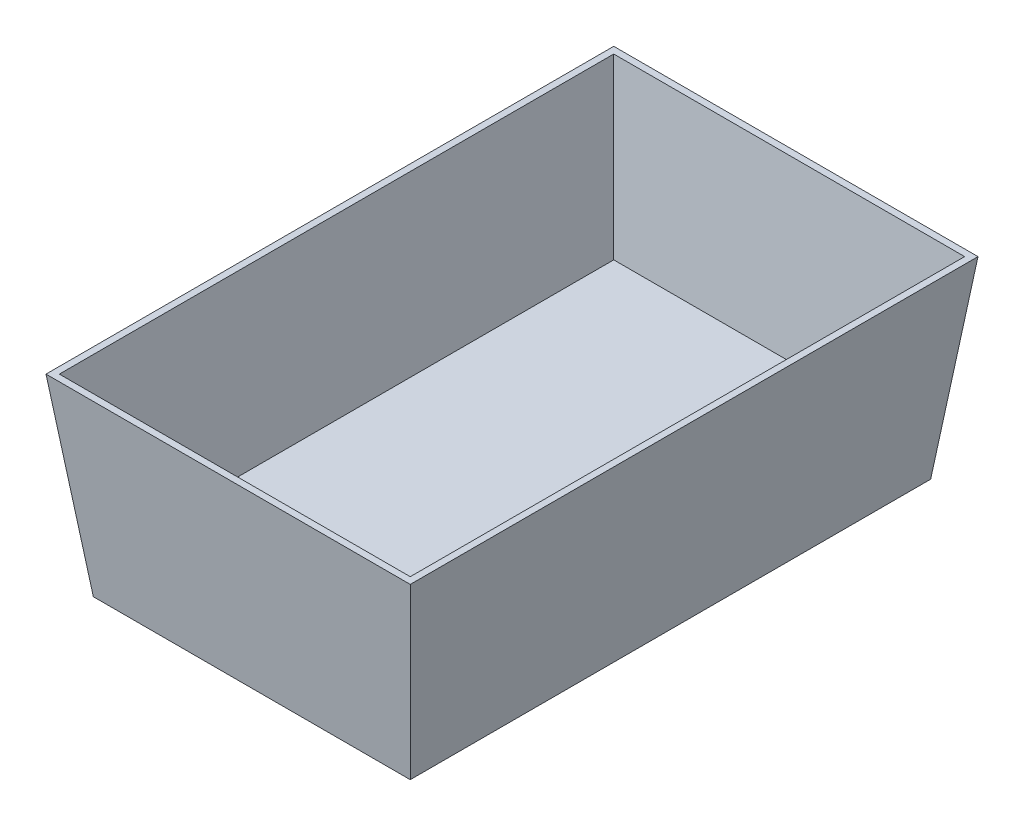
ISO-10303-21;
HEADER;
FILE_DESCRIPTION(('STEP AP214'),'2;1');
FILE_NAME('part.step','',(''),(''),'','','');
FILE_SCHEMA(('AUTOMOTIVE_DESIGN { 1 0 10303 214 1 1 1 1 }'));
ENDSEC;
DATA;
#1=APPLICATION_CONTEXT('core data for automotive mechanical design processes');
#2=APPLICATION_PROTOCOL_DEFINITION('international standard','automotive_design',2000,#1);
#3=PRODUCT_CONTEXT('',#1,'mechanical');
#4=PRODUCT('Part','Part','',(#3));
#5=PRODUCT_RELATED_PRODUCT_CATEGORY('part','',(#4));
#6=PRODUCT_DEFINITION_FORMATION('','',#4);
#7=PRODUCT_DEFINITION_CONTEXT('part definition',#1,'design');
#8=PRODUCT_DEFINITION('design','',#6,#7);
#9=PRODUCT_DEFINITION_SHAPE('','',#8);
#10=(LENGTH_UNIT() NAMED_UNIT(*) SI_UNIT(.MILLI.,.METRE.));
#11=(NAMED_UNIT(*) PLANE_ANGLE_UNIT() SI_UNIT($,.RADIAN.));
#12=(NAMED_UNIT(*) SI_UNIT($,.STERADIAN.) SOLID_ANGLE_UNIT());
#13=UNCERTAINTY_MEASURE_WITH_UNIT(LENGTH_MEASURE(1.E-05),#10,'distance_accuracy_value','');
#14=(GEOMETRIC_REPRESENTATION_CONTEXT(3) GLOBAL_UNCERTAINTY_ASSIGNED_CONTEXT((#13)) GLOBAL_UNIT_ASSIGNED_CONTEXT((#10,
#11,#12)) REPRESENTATION_CONTEXT('',''));
#15=CARTESIAN_POINT('',(0.,0.,0.));
#16=DIRECTION('',(0.,0.,1.));
#17=DIRECTION('',(1.,0.,0.));
#18=AXIS2_PLACEMENT_3D('',#15,#16,#17);
#19=CARTESIAN_POINT('',(-227.895753161623,0.,-294.347660511142));
#20=DIRECTION('',(0.992546151641322,-0.121869343405148,0.));
#21=DIRECTION('',(0.121869343405148,0.992546151641322,0.));
#22=AXIS2_PLACEMENT_3D('',#19,#20,#21);
#23=PLANE('',#22);
#24=DIRECTION('',(0.,0.,-1.));
#25=VECTOR('',#24,1.);
#26=CARTESIAN_POINT('',(-227.895753161623,0.,-294.347660511142));
#27=LINE('',#26,#25);
#28=CARTESIAN_POINT('',(-227.895753161623,0.,485.652339488858));
#29=VERTEX_POINT('',#28);
#30=CARTESIAN_POINT('',(-227.895753161623,0.,-294.347660511142));
#31=VERTEX_POINT('',#30);
#32=EDGE_CURVE('E141',#29,#31,#27,.T.);
#33=ORIENTED_EDGE('',*,*,#32,.T.);
#34=DIRECTION('',(-0.120974291151355,-0.985256536015293,0.120974291151355));
#35=VECTOR('',#34,1.);
#36=CARTESIAN_POINT('',(-227.895753161623,0.,-294.347660511142));
#37=LINE('',#36,#35);
#38=CARTESIAN_POINT('',(-192.411015060684,289.,-329.832398612081));
#39=VERTEX_POINT('',#38);
#40=EDGE_CURVE('E11',#39,#31,#37,.T.);
#41=ORIENTED_EDGE('',*,*,#40,.F.);
#42=DIRECTION('',(0.,0.,1.));
#43=VECTOR('',#42,1.);
#44=CARTESIAN_POINT('',(-192.411015060684,289.,0.));
#45=LINE('',#44,#43);
#46=CARTESIAN_POINT('',(-192.411015060683,289.,521.137077589798));
#47=VERTEX_POINT('',#46);
#48=EDGE_CURVE('E169',#47,#39,#45,.F.);
#49=ORIENTED_EDGE('',*,*,#48,.F.);
#50=DIRECTION('',(-0.120974291151355,-0.985256536015293,-0.120974291151355));
#51=VECTOR('',#50,1.);
#52=CARTESIAN_POINT('',(-239.31088087489,-92.9687546164175,474.237211775591));
#53=LINE('',#52,#51);
#54=EDGE_CURVE('E171',#47,#29,#53,.T.);
#55=ORIENTED_EDGE('',*,*,#54,.T.);
#56=EDGE_LOOP('',(#33,#41,#49,#55));
#57=FACE_BOUND('',#56,.T.);
#58=ADVANCED_FACE('F39',(#57),#23,.T.);
#59=CARTESIAN_POINT('',(-227.895753161623,0.,-294.347660511142));
#60=DIRECTION('',(0.,-0.121869343405148,-0.992546151641322));
#61=DIRECTION('',(0.,0.992546151641322,-0.121869343405148));
#62=AXIS2_PLACEMENT_3D('',#59,#60,#61);
#63=PLANE('',#62);
#64=DIRECTION('',(-1.,0.,0.));
#65=VECTOR('',#64,1.);
#66=CARTESIAN_POINT('',(-227.895753161623,0.,-294.347660511142));
#67=LINE('',#66,#65);
#68=CARTESIAN_POINT('',(-702.895753161623,0.,-294.347660511142));
#69=VERTEX_POINT('',#68);
#70=EDGE_CURVE('E161',#31,#69,#67,.T.);
#71=ORIENTED_EDGE('',*,*,#70,.T.);
#72=DIRECTION('',(0.120974291151355,-0.985256536015293,0.120974291151355));
#73=VECTOR('',#72,1.);
#74=CARTESIAN_POINT('',(-702.895753161623,0.,-294.347660511142));
#75=LINE('',#74,#73);
#76=CARTESIAN_POINT('',(-738.380491262562,289.,-329.832398612081));
#77=VERTEX_POINT('',#76);
#78=EDGE_CURVE('E49',#77,#69,#75,.T.);
#79=ORIENTED_EDGE('',*,*,#78,.F.);
#80=DIRECTION('',(1.,0.,0.));
#81=VECTOR('',#80,1.);
#82=CARTESIAN_POINT('',(0.,289.,-329.832398612081));
#83=LINE('',#82,#81);
#84=EDGE_CURVE('E184',#39,#77,#83,.F.);
#85=ORIENTED_EDGE('',*,*,#84,.F.);
#86=ORIENTED_EDGE('',*,*,#40,.T.);
#87=EDGE_LOOP('',(#71,#79,#85,#86));
#88=FACE_BOUND('',#87,.T.);
#89=ADVANCED_FACE('F41',(#88),#63,.T.);
#90=CARTESIAN_POINT('',(-702.895753161623,0.,-294.347660511142));
#91=DIRECTION('',(-0.992546151641322,-0.121869343405148,0.));
#92=DIRECTION('',(0.121869343405148,-0.992546151641322,0.));
#93=AXIS2_PLACEMENT_3D('',#90,#91,#92);
#94=PLANE('',#93);
#95=DIRECTION('',(0.,0.,1.));
#96=VECTOR('',#95,1.);
#97=CARTESIAN_POINT('',(-702.895753161623,0.,-294.347660511142));
#98=LINE('',#97,#96);
#99=CARTESIAN_POINT('',(-702.895753161623,0.,485.652339488858));
#100=VERTEX_POINT('',#99);
#101=EDGE_CURVE('E164',#69,#100,#98,.T.);
#102=ORIENTED_EDGE('',*,*,#101,.T.);
#103=DIRECTION('',(0.120974291151355,-0.985256536015293,-0.120974291151355));
#104=VECTOR('',#103,1.);
#105=CARTESIAN_POINT('',(-695.944233079826,-56.6155877471774,478.700819407061));
#106=LINE('',#105,#104);
#107=CARTESIAN_POINT('',(-738.380491262562,289.,521.137077589798));
#108=VERTEX_POINT('',#107);
#109=EDGE_CURVE('E175',#108,#100,#106,.T.);
#110=ORIENTED_EDGE('',*,*,#109,.F.);
#111=DIRECTION('',(0.,0.,-1.));
#112=VECTOR('',#111,1.);
#113=CARTESIAN_POINT('',(-738.380491262562,289.,0.));
#114=LINE('',#113,#112);
#115=EDGE_CURVE('E186',#77,#108,#114,.F.);
#116=ORIENTED_EDGE('',*,*,#115,.F.);
#117=ORIENTED_EDGE('',*,*,#78,.T.);
#118=EDGE_LOOP('',(#102,#110,#116,#117));
#119=FACE_BOUND('',#118,.T.);
#120=ADVANCED_FACE('F193',(#119),#94,.T.);
#121=CARTESIAN_POINT('',(-227.895753161623,0.,485.652339488858));
#122=DIRECTION('',(0.,-0.121869343405148,0.992546151641322));
#123=DIRECTION('',(0.,-0.992546151641322,-0.121869343405148));
#124=AXIS2_PLACEMENT_3D('',#121,#122,#123);
#125=PLANE('',#124);
#126=DIRECTION('',(1.,0.,0.));
#127=VECTOR('',#126,1.);
#128=CARTESIAN_POINT('',(-227.895753161623,0.,485.652339488858));
#129=LINE('',#128,#127);
#130=EDGE_CURVE('E167',#100,#29,#129,.T.);
#131=ORIENTED_EDGE('',*,*,#130,.T.);
#132=ORIENTED_EDGE('',*,*,#54,.F.);
#133=DIRECTION('',(-1.,0.,0.));
#134=VECTOR('',#133,1.);
#135=CARTESIAN_POINT('',(0.,289.,521.137077589798));
#136=LINE('',#135,#134);
#137=EDGE_CURVE('E43',#108,#47,#136,.F.);
#138=ORIENTED_EDGE('',*,*,#137,.F.);
#139=ORIENTED_EDGE('',*,*,#109,.T.);
#140=EDGE_LOOP('',(#131,#132,#138,#139));
#141=FACE_BOUND('',#140,.T.);
#142=ADVANCED_FACE('F197',(#141),#125,.T.);
#143=CARTESIAN_POINT('',(0.,289.,0.));
#144=DIRECTION('',(0.,-1.,0.));
#145=DIRECTION('',(0.,0.,-1.));
#146=AXIS2_PLACEMENT_3D('',#143,#144,#145);
#147=PLANE('',#146);
#148=DIRECTION('',(1.,0.,0.));
#149=VECTOR('',#148,1.);
#150=CARTESIAN_POINT('',(-728.380491262562,289.,511.137077589798));
#151=LINE('',#150,#149);
#152=CARTESIAN_POINT('',(-728.380491262562,289.,511.137077589798));
#153=VERTEX_POINT('',#152);
#154=CARTESIAN_POINT('',(-202.411015060684,289.,511.137077589798));
#155=VERTEX_POINT('',#154);
#156=EDGE_CURVE('E123',#153,#155,#151,.T.);
#157=ORIENTED_EDGE('',*,*,#156,.F.);
#158=DIRECTION('',(0.,0.,1.));
#159=VECTOR('',#158,1.);
#160=CARTESIAN_POINT('',(-728.380491262562,289.,-319.832398612081));
#161=LINE('',#160,#159);
#162=CARTESIAN_POINT('',(-728.380491262562,289.,-319.832398612081));
#163=VERTEX_POINT('',#162);
#164=EDGE_CURVE('E57',#163,#153,#161,.T.);
#165=ORIENTED_EDGE('',*,*,#164,.F.);
#166=DIRECTION('',(-1.,0.,0.));
#167=VECTOR('',#166,1.);
#168=CARTESIAN_POINT('',(-728.380491262562,289.,-319.832398612081));
#169=LINE('',#168,#167);
#170=CARTESIAN_POINT('',(-202.411015060684,289.,-319.832398612081));
#171=VERTEX_POINT('',#170);
#172=EDGE_CURVE('E130',#171,#163,#169,.T.);
#173=ORIENTED_EDGE('',*,*,#172,.F.);
#174=DIRECTION('',(0.,0.,-1.));
#175=VECTOR('',#174,1.);
#176=CARTESIAN_POINT('',(-202.411015060684,289.,-319.832398612081));
#177=LINE('',#176,#175);
#178=EDGE_CURVE('E111',#155,#171,#177,.T.);
#179=ORIENTED_EDGE('',*,*,#178,.F.);
#180=EDGE_LOOP('',(#157,#165,#173,#179));
#181=FACE_BOUND('',#180,.T.);
#182=ORIENTED_EDGE('',*,*,#48,.T.);
#183=ORIENTED_EDGE('',*,*,#84,.T.);
#184=ORIENTED_EDGE('',*,*,#115,.T.);
#185=ORIENTED_EDGE('',*,*,#137,.T.);
#186=EDGE_LOOP('',(#182,#183,#184,#185));
#187=FACE_BOUND('',#186,.T.);
#188=ADVANCED_FACE('F128',(#181,#187),#147,.F.);
#189=CARTESIAN_POINT('',(0.,0.,0.));
#190=DIRECTION('',(0.,-1.,0.));
#191=DIRECTION('',(0.,0.,-1.));
#192=AXIS2_PLACEMENT_3D('',#189,#190,#191);
#193=PLANE('',#192);
#194=ORIENTED_EDGE('',*,*,#32,.F.);
#195=ORIENTED_EDGE('',*,*,#130,.F.);
#196=ORIENTED_EDGE('',*,*,#101,.F.);
#197=ORIENTED_EDGE('',*,*,#70,.F.);
#198=EDGE_LOOP('',(#194,#195,#196,#197));
#199=FACE_BOUND('',#198,.T.);
#200=ADVANCED_FACE('F204',(#199),#193,.T.);
#201=CARTESIAN_POINT('',(-728.380491262562,289.,-319.832398612081));
#202=DIRECTION('',(-0.992546151641322,-0.121869343405148,0.));
#203=DIRECTION('',(0.121869343405148,-0.992546151641322,0.));
#204=AXIS2_PLACEMENT_3D('',#201,#202,#203);
#205=PLANE('',#204);
#206=ORIENTED_EDGE('',*,*,#164,.T.);
#207=DIRECTION('',(-0.120974291151355,0.985256536015293,0.120974291151355));
#208=VECTOR('',#207,1.);
#209=CARTESIAN_POINT('',(-716.219436523241,189.956157273403,498.976022850476));
#210=LINE('',#209,#208);
#211=CARTESIAN_POINT('',(-699.157765767671,51.,481.914352094907));
#212=VERTEX_POINT('',#211);
#213=EDGE_CURVE('E120',#212,#153,#210,.T.);
#214=ORIENTED_EDGE('',*,*,#213,.F.);
#215=DIRECTION('',(0.,0.,1.));
#216=VECTOR('',#215,1.);
#217=CARTESIAN_POINT('',(-699.157765767671,51.,0.));
#218=LINE('',#217,#216);
#219=CARTESIAN_POINT('',(-699.157765767671,51.,-290.60967311719));
#220=VERTEX_POINT('',#219);
#221=EDGE_CURVE('E134',#220,#212,#218,.T.);
#222=ORIENTED_EDGE('',*,*,#221,.F.);
#223=DIRECTION('',(-0.120974291151355,0.985256536015293,-0.120974291151355));
#224=VECTOR('',#223,1.);
#225=CARTESIAN_POINT('',(-728.380491262562,289.,-319.832398612081));
#226=LINE('',#225,#224);
#227=EDGE_CURVE('E138',#220,#163,#226,.T.);
#228=ORIENTED_EDGE('',*,*,#227,.T.);
#229=EDGE_LOOP('',(#206,#214,#222,#228));
#230=FACE_BOUND('',#229,.T.);
#231=ADVANCED_FACE('F206',(#230),#205,.F.);
#232=CARTESIAN_POINT('',(-728.380491262562,289.,-319.832398612081));
#233=DIRECTION('',(0.,-0.121869343405148,-0.992546151641322));
#234=DIRECTION('',(0.,0.992546151641322,-0.121869343405148));
#235=AXIS2_PLACEMENT_3D('',#232,#233,#234);
#236=PLANE('',#235);
#237=ORIENTED_EDGE('',*,*,#172,.T.);
#238=ORIENTED_EDGE('',*,*,#227,.F.);
#239=DIRECTION('',(-1.,0.,0.));
#240=VECTOR('',#239,1.);
#241=CARTESIAN_POINT('',(0.,51.,-290.60967311719));
#242=LINE('',#241,#240);
#243=CARTESIAN_POINT('',(-231.633740555575,51.,-290.60967311719));
#244=VERTEX_POINT('',#243);
#245=EDGE_CURVE('E143',#244,#220,#242,.T.);
#246=ORIENTED_EDGE('',*,*,#245,.F.);
#247=DIRECTION('',(0.120974291151355,0.985256536015293,-0.120974291151355));
#248=VECTOR('',#247,1.);
#249=CARTESIAN_POINT('',(-202.411015060684,289.,-319.832398612081));
#250=LINE('',#249,#248);
#251=EDGE_CURVE('E119',#244,#171,#250,.T.);
#252=ORIENTED_EDGE('',*,*,#251,.T.);
#253=EDGE_LOOP('',(#237,#238,#246,#252));
#254=FACE_BOUND('',#253,.T.);
#255=ADVANCED_FACE('F212',(#254),#236,.F.);
#256=CARTESIAN_POINT('',(-202.411015060684,289.,-319.832398612081));
#257=DIRECTION('',(0.992546151641322,-0.121869343405148,0.));
#258=DIRECTION('',(0.121869343405148,0.992546151641322,0.));
#259=AXIS2_PLACEMENT_3D('',#256,#257,#258);
#260=PLANE('',#259);
#261=ORIENTED_EDGE('',*,*,#178,.T.);
#262=ORIENTED_EDGE('',*,*,#251,.F.);
#263=DIRECTION('',(0.,0.,-1.));
#264=VECTOR('',#263,1.);
#265=CARTESIAN_POINT('',(-231.633740555575,51.,0.));
#266=LINE('',#265,#264);
#267=CARTESIAN_POINT('',(-231.633740555575,51.,481.914352094907));
#268=VERTEX_POINT('',#267);
#269=EDGE_CURVE('E114',#268,#244,#266,.T.);
#270=ORIENTED_EDGE('',*,*,#269,.F.);
#271=DIRECTION('',(0.120974291151355,0.985256536015293,0.120974291151355));
#272=VECTOR('',#271,1.);
#273=CARTESIAN_POINT('',(-210.108462168535,226.309324142643,503.439630481946));
#274=LINE('',#273,#272);
#275=EDGE_CURVE('E107',#268,#155,#274,.T.);
#276=ORIENTED_EDGE('',*,*,#275,.T.);
#277=EDGE_LOOP('',(#261,#262,#270,#276));
#278=FACE_BOUND('',#277,.T.);
#279=ADVANCED_FACE('F109',(#278),#260,.F.);
#280=CARTESIAN_POINT('',(-728.380491262562,289.,511.137077589798));
#281=DIRECTION('',(0.,-0.121869343405148,0.992546151641322));
#282=DIRECTION('',(0.,-0.992546151641322,-0.121869343405148));
#283=AXIS2_PLACEMENT_3D('',#280,#281,#282);
#284=PLANE('',#283);
#285=ORIENTED_EDGE('',*,*,#156,.T.);
#286=ORIENTED_EDGE('',*,*,#275,.F.);
#287=DIRECTION('',(1.,0.,0.));
#288=VECTOR('',#287,1.);
#289=CARTESIAN_POINT('',(0.,51.,481.914352094907));
#290=LINE('',#289,#288);
#291=EDGE_CURVE('E150',#212,#268,#290,.T.);
#292=ORIENTED_EDGE('',*,*,#291,.F.);
#293=ORIENTED_EDGE('',*,*,#213,.T.);
#294=EDGE_LOOP('',(#285,#286,#292,#293));
#295=FACE_BOUND('',#294,.T.);
#296=ADVANCED_FACE('F124',(#295),#284,.F.);
#297=CARTESIAN_POINT('',(0.,51.,0.));
#298=DIRECTION('',(0.,1.,0.));
#299=DIRECTION('',(0.,0.,1.));
#300=AXIS2_PLACEMENT_3D('',#297,#298,#299);
#301=PLANE('',#300);
#302=ORIENTED_EDGE('',*,*,#221,.T.);
#303=ORIENTED_EDGE('',*,*,#291,.T.);
#304=ORIENTED_EDGE('',*,*,#269,.T.);
#305=ORIENTED_EDGE('',*,*,#245,.T.);
#306=EDGE_LOOP('',(#302,#303,#304,#305));
#307=FACE_BOUND('',#306,.T.);
#308=ADVANCED_FACE('F269',(#307),#301,.T.);
#309=CLOSED_SHELL('',(#58,#89,#120,#142,#188,#200,#231,#255,#279,#296,#308));
#310=MANIFOLD_SOLID_BREP('B2',#309);
#311=ADVANCED_BREP_SHAPE_REPRESENTATION('',(#18,#310),#14);
#312=SHAPE_DEFINITION_REPRESENTATION(#9,#311);
ENDSEC;
END-ISO-10303-21;
